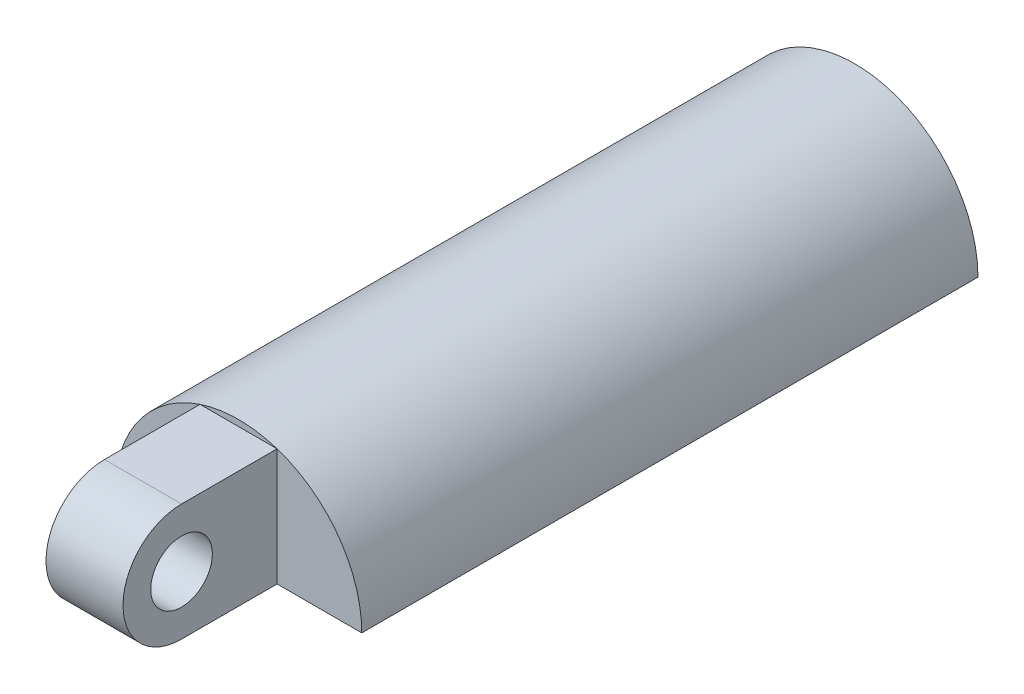
ISO-10303-21;
HEADER;
FILE_DESCRIPTION(('STEP AP214'),'2;1');
FILE_NAME('part.step','',(''),(''),'','','');
FILE_SCHEMA(('AUTOMOTIVE_DESIGN { 1 0 10303 214 1 1 1 1 }'));
ENDSEC;
DATA;
#1=APPLICATION_CONTEXT('core data for automotive mechanical design processes');
#2=APPLICATION_PROTOCOL_DEFINITION('international standard','automotive_design',2000,#1);
#3=PRODUCT_CONTEXT('',#1,'mechanical');
#4=PRODUCT('Part','Part','',(#3));
#5=PRODUCT_RELATED_PRODUCT_CATEGORY('part','',(#4));
#6=PRODUCT_DEFINITION_FORMATION('','',#4);
#7=PRODUCT_DEFINITION_CONTEXT('part definition',#1,'design');
#8=PRODUCT_DEFINITION('design','',#6,#7);
#9=PRODUCT_DEFINITION_SHAPE('','',#8);
#10=(LENGTH_UNIT() NAMED_UNIT(*) SI_UNIT(.MILLI.,.METRE.));
#11=(NAMED_UNIT(*) PLANE_ANGLE_UNIT() SI_UNIT($,.RADIAN.));
#12=(NAMED_UNIT(*) SI_UNIT($,.STERADIAN.) SOLID_ANGLE_UNIT());
#13=UNCERTAINTY_MEASURE_WITH_UNIT(LENGTH_MEASURE(1.E-05),#10,'distance_accuracy_value','');
#14=(GEOMETRIC_REPRESENTATION_CONTEXT(3) GLOBAL_UNCERTAINTY_ASSIGNED_CONTEXT((#13)) GLOBAL_UNIT_ASSIGNED_CONTEXT((#10,
#11,#12)) REPRESENTATION_CONTEXT('',''));
#15=CARTESIAN_POINT('',(0.,0.,0.));
#16=DIRECTION('',(0.,0.,1.));
#17=DIRECTION('',(1.,0.,0.));
#18=AXIS2_PLACEMENT_3D('',#15,#16,#17);
#19=CARTESIAN_POINT('',(-2.5,0.,50.));
#20=DIRECTION('',(-1.,0.,0.));
#21=DIRECTION('',(0.,0.,1.));
#22=AXIS2_PLACEMENT_3D('',#19,#20,#21);
#23=PLANE('',#22);
#24=CARTESIAN_POINT('',(-2.5,3.79967103839266,46.2003289616073));
#25=DIRECTION('',(-1.,0.,0.));
#26=DIRECTION('',(0.,0.,1.));
#27=AXIS2_PLACEMENT_3D('',#24,#25,#26);
#28=CIRCLE('',#27,2.);
#29=CARTESIAN_POINT('',(-2.5,3.79967103839266,48.2003289616073));
#30=VERTEX_POINT('',#29);
#31=EDGE_CURVE('E173',#30,#30,#28,.F.);
#32=ORIENTED_EDGE('',*,*,#31,.T.);
#33=EDGE_LOOP('',(#32));
#34=FACE_BOUND('',#33,.T.);
#35=DIRECTION('',(0.,0.,-1.));
#36=VECTOR('',#35,1.);
#37=CARTESIAN_POINT('',(-2.5,0.,50.));
#38=LINE('',#37,#36);
#39=CARTESIAN_POINT('',(-2.5,0.,46.2003289616073));
#40=VERTEX_POINT('',#39);
#41=CARTESIAN_POINT('',(-2.5,0.,40.));
#42=VERTEX_POINT('',#41);
#43=EDGE_CURVE('E78',#40,#42,#38,.T.);
#44=ORIENTED_EDGE('',*,*,#43,.F.);
#45=CARTESIAN_POINT('',(-2.5,3.79967103839266,46.2003289616073));
#46=DIRECTION('',(-1.,0.,0.));
#47=DIRECTION('',(0.,0.,1.));
#48=AXIS2_PLACEMENT_3D('',#45,#46,#47);
#49=CIRCLE('',#48,3.79967103839266);
#50=CARTESIAN_POINT('',(-2.5,7.59934207678533,46.2003289616073));
#51=VERTEX_POINT('',#50);
#52=EDGE_CURVE('E111',#51,#40,#49,.F.);
#53=ORIENTED_EDGE('',*,*,#52,.F.);
#54=DIRECTION('',(0.,0.,-1.));
#55=VECTOR('',#54,1.);
#56=CARTESIAN_POINT('',(-2.5,7.59934207678533,50.));
#57=LINE('',#56,#55);
#58=CARTESIAN_POINT('',(-2.5,7.59934207678533,40.));
#59=VERTEX_POINT('',#58);
#60=EDGE_CURVE('E139',#51,#59,#57,.T.);
#61=ORIENTED_EDGE('',*,*,#60,.T.);
#62=DIRECTION('',(0.,1.,0.));
#63=VECTOR('',#62,1.);
#64=CARTESIAN_POINT('',(-2.5,0.,40.));
#65=LINE('',#64,#63);
#66=EDGE_CURVE('E126',#42,#59,#65,.T.);
#67=ORIENTED_EDGE('',*,*,#66,.F.);
#68=EDGE_LOOP('',(#44,#53,#61,#67));
#69=FACE_BOUND('',#68,.T.);
#70=ADVANCED_FACE('F55',(#34,#69),#23,.T.);
#71=CARTESIAN_POINT('',(2.5,0.,50.));
#72=DIRECTION('',(-1.,0.,0.));
#73=DIRECTION('',(0.,0.,1.));
#74=AXIS2_PLACEMENT_3D('',#71,#72,#73);
#75=PLANE('',#74);
#76=CARTESIAN_POINT('',(2.5,3.79967103839266,46.2003289616073));
#77=DIRECTION('',(1.,0.,0.));
#78=DIRECTION('',(0.,0.,-1.));
#79=AXIS2_PLACEMENT_3D('',#76,#77,#78);
#80=CIRCLE('',#79,2.);
#81=CARTESIAN_POINT('',(2.5,3.79967103839266,44.2003289616073));
#82=VERTEX_POINT('',#81);
#83=EDGE_CURVE('E122',#82,#82,#80,.T.);
#84=ORIENTED_EDGE('',*,*,#83,.F.);
#85=EDGE_LOOP('',(#84));
#86=FACE_BOUND('',#85,.T.);
#87=CARTESIAN_POINT('',(2.5,3.79967103839266,46.2003289616073));
#88=DIRECTION('',(1.,0.,0.));
#89=DIRECTION('',(0.,0.,-1.));
#90=AXIS2_PLACEMENT_3D('',#87,#88,#89);
#91=CIRCLE('',#90,3.79967103839266);
#92=CARTESIAN_POINT('',(2.5,7.59934207678533,46.2003289616073));
#93=VERTEX_POINT('',#92);
#94=CARTESIAN_POINT('',(2.5,0.,46.2003289616073));
#95=VERTEX_POINT('',#94);
#96=EDGE_CURVE('E118',#93,#95,#91,.T.);
#97=ORIENTED_EDGE('',*,*,#96,.T.);
#98=DIRECTION('',(0.,0.,-1.));
#99=VECTOR('',#98,1.);
#100=CARTESIAN_POINT('',(2.5,0.,50.));
#101=LINE('',#100,#99);
#102=CARTESIAN_POINT('',(2.5,0.,40.));
#103=VERTEX_POINT('',#102);
#104=EDGE_CURVE('E70',#95,#103,#101,.T.);
#105=ORIENTED_EDGE('',*,*,#104,.T.);
#106=DIRECTION('',(0.,1.,0.));
#107=VECTOR('',#106,1.);
#108=CARTESIAN_POINT('',(2.5,0.,40.));
#109=LINE('',#108,#107);
#110=CARTESIAN_POINT('',(2.5,7.59934207678533,40.));
#111=VERTEX_POINT('',#110);
#112=EDGE_CURVE('E135',#103,#111,#109,.T.);
#113=ORIENTED_EDGE('',*,*,#112,.T.);
#114=DIRECTION('',(0.,0.,-1.));
#115=VECTOR('',#114,1.);
#116=CARTESIAN_POINT('',(2.5,7.59934207678533,50.));
#117=LINE('',#116,#115);
#118=EDGE_CURVE('E132',#93,#111,#117,.T.);
#119=ORIENTED_EDGE('',*,*,#118,.F.);
#120=EDGE_LOOP('',(#97,#105,#113,#119));
#121=FACE_BOUND('',#120,.T.);
#122=ADVANCED_FACE('F181',(#86,#121),#75,.F.);
#123=CARTESIAN_POINT('',(0.,0.,40.));
#124=DIRECTION('',(0.,1.,0.));
#125=DIRECTION('',(0.,0.,1.));
#126=AXIS2_PLACEMENT_3D('',#123,#124,#125);
#127=PLANE('',#126);
#128=DIRECTION('',(1.,0.,0.));
#129=VECTOR('',#128,1.);
#130=CARTESIAN_POINT('',(-8.001,0.,46.2003289616073));
#131=LINE('',#130,#129);
#132=EDGE_CURVE('E113',#40,#95,#131,.T.);
#133=ORIENTED_EDGE('',*,*,#132,.F.);
#134=ORIENTED_EDGE('',*,*,#43,.T.);
#135=DIRECTION('',(1.,0.,0.));
#136=VECTOR('',#135,1.);
#137=CARTESIAN_POINT('',(0.,0.,40.));
#138=LINE('',#137,#136);
#139=CARTESIAN_POINT('',(-8.,0.,40.));
#140=VERTEX_POINT('',#139);
#141=EDGE_CURVE('E147',#140,#42,#138,.T.);
#142=ORIENTED_EDGE('',*,*,#141,.F.);
#143=DIRECTION('',(0.,0.,-1.));
#144=VECTOR('',#143,1.);
#145=CARTESIAN_POINT('',(-8.,0.,40.));
#146=LINE('',#145,#144);
#147=CARTESIAN_POINT('',(-8.,0.,0.));
#148=VERTEX_POINT('',#147);
#149=EDGE_CURVE('E12',#140,#148,#146,.T.);
#150=ORIENTED_EDGE('',*,*,#149,.T.);
#151=DIRECTION('',(1.,0.,0.));
#152=VECTOR('',#151,1.);
#153=CARTESIAN_POINT('',(0.,0.,0.));
#154=LINE('',#153,#152);
#155=CARTESIAN_POINT('',(8.,0.,0.));
#156=VERTEX_POINT('',#155);
#157=EDGE_CURVE('E130',#148,#156,#154,.T.);
#158=ORIENTED_EDGE('',*,*,#157,.T.);
#159=DIRECTION('',(0.,0.,-1.));
#160=VECTOR('',#159,1.);
#161=CARTESIAN_POINT('',(8.,0.,40.));
#162=LINE('',#161,#160);
#163=CARTESIAN_POINT('',(8.,0.,40.));
#164=VERTEX_POINT('',#163);
#165=EDGE_CURVE('E63',#164,#156,#162,.T.);
#166=ORIENTED_EDGE('',*,*,#165,.F.);
#167=EDGE_CURVE('E144',#103,#164,#138,.T.);
#168=ORIENTED_EDGE('',*,*,#167,.F.);
#169=ORIENTED_EDGE('',*,*,#104,.F.);
#170=EDGE_LOOP('',(#133,#134,#142,#150,#158,#166,#168,#169));
#171=FACE_BOUND('',#170,.T.);
#172=ADVANCED_FACE('F120',(#171),#127,.F.);
#173=CARTESIAN_POINT('',(-2.5,7.59934207678533,50.));
#174=DIRECTION('',(0.,1.,0.));
#175=DIRECTION('',(0.,0.,1.));
#176=AXIS2_PLACEMENT_3D('',#173,#174,#175);
#177=PLANE('',#176);
#178=ORIENTED_EDGE('',*,*,#60,.F.);
#179=DIRECTION('',(1.,0.,0.));
#180=VECTOR('',#179,1.);
#181=CARTESIAN_POINT('',(-8.001,7.59934207678533,46.2003289616073));
#182=LINE('',#181,#180);
#183=EDGE_CURVE('E115',#51,#93,#182,.T.);
#184=ORIENTED_EDGE('',*,*,#183,.T.);
#185=ORIENTED_EDGE('',*,*,#118,.T.);
#186=DIRECTION('',(1.,0.,0.));
#187=VECTOR('',#186,1.);
#188=CARTESIAN_POINT('',(-2.5,7.59934207678533,40.));
#189=LINE('',#188,#187);
#190=EDGE_CURVE('E165',#59,#111,#189,.T.);
#191=ORIENTED_EDGE('',*,*,#190,.F.);
#192=EDGE_LOOP('',(#178,#184,#185,#191));
#193=FACE_BOUND('',#192,.T.);
#194=ADVANCED_FACE('F167',(#193),#177,.T.);
#195=CARTESIAN_POINT('',(0.,0.,40.));
#196=DIRECTION('',(0.,0.,1.));
#197=DIRECTION('',(1.,0.,0.));
#198=AXIS2_PLACEMENT_3D('',#195,#196,#197);
#199=PLANE('',#198);
#200=ORIENTED_EDGE('',*,*,#141,.T.);
#201=ORIENTED_EDGE('',*,*,#66,.T.);
#202=CARTESIAN_POINT('',(0.,0.,40.));
#203=DIRECTION('',(0.,0.,1.));
#204=DIRECTION('',(1.,0.,0.));
#205=AXIS2_PLACEMENT_3D('',#202,#203,#204);
#206=CIRCLE('',#205,8.);
#207=EDGE_CURVE('E146',#59,#140,#206,.T.);
#208=ORIENTED_EDGE('',*,*,#207,.T.);
#209=EDGE_LOOP('',(#200,#201,#208));
#210=FACE_BOUND('',#209,.T.);
#211=ADVANCED_FACE('F188',(#210),#199,.T.);
#212=EDGE_CURVE('E145',#111,#59,#206,.T.);
#213=ORIENTED_EDGE('',*,*,#212,.T.);
#214=ORIENTED_EDGE('',*,*,#190,.T.);
#215=EDGE_LOOP('',(#213,#214));
#216=FACE_BOUND('',#215,.T.);
#217=ADVANCED_FACE('F164',(#216),#199,.T.);
#218=CARTESIAN_POINT('',(0.,0.,40.));
#219=DIRECTION('',(0.,0.,-1.));
#220=DIRECTION('',(-1.,0.,0.));
#221=AXIS2_PLACEMENT_3D('',#218,#219,#220);
#222=CYLINDRICAL_SURFACE('',#221,8.);
#223=CARTESIAN_POINT('',(0.,0.,0.));
#224=DIRECTION('',(0.,0.,1.));
#225=DIRECTION('',(1.,0.,0.));
#226=AXIS2_PLACEMENT_3D('',#223,#224,#225);
#227=CIRCLE('',#226,8.);
#228=EDGE_CURVE('E127',#156,#148,#227,.T.);
#229=ORIENTED_EDGE('',*,*,#228,.T.);
#230=ORIENTED_EDGE('',*,*,#149,.F.);
#231=ORIENTED_EDGE('',*,*,#207,.F.);
#232=ORIENTED_EDGE('',*,*,#212,.F.);
#233=EDGE_CURVE('E141',#164,#111,#206,.T.);
#234=ORIENTED_EDGE('',*,*,#233,.F.);
#235=ORIENTED_EDGE('',*,*,#165,.T.);
#236=EDGE_LOOP('',(#229,#230,#231,#232,#234,#235));
#237=FACE_BOUND('',#236,.T.);
#238=ADVANCED_FACE('F57',(#237),#222,.T.);
#239=ORIENTED_EDGE('',*,*,#112,.F.);
#240=ORIENTED_EDGE('',*,*,#167,.T.);
#241=ORIENTED_EDGE('',*,*,#233,.T.);
#242=EDGE_LOOP('',(#239,#240,#241));
#243=FACE_BOUND('',#242,.T.);
#244=ADVANCED_FACE('F185',(#243),#199,.T.);
#245=CARTESIAN_POINT('',(0.,0.,0.));
#246=DIRECTION('',(0.,0.,1.));
#247=DIRECTION('',(1.,0.,0.));
#248=AXIS2_PLACEMENT_3D('',#245,#246,#247);
#249=PLANE('',#248);
#250=ORIENTED_EDGE('',*,*,#228,.F.);
#251=ORIENTED_EDGE('',*,*,#157,.F.);
#252=EDGE_LOOP('',(#250,#251));
#253=FACE_BOUND('',#252,.T.);
#254=ADVANCED_FACE('F157',(#253),#249,.F.);
#255=CARTESIAN_POINT('',(-8.001,3.79967103839266,46.2003289616073));
#256=DIRECTION('',(1.,0.,0.));
#257=DIRECTION('',(0.,0.,-1.));
#258=AXIS2_PLACEMENT_3D('',#255,#256,#257);
#259=CYLINDRICAL_SURFACE('',#258,3.79967103839266);
#260=ORIENTED_EDGE('',*,*,#52,.T.);
#261=ORIENTED_EDGE('',*,*,#132,.T.);
#262=ORIENTED_EDGE('',*,*,#96,.F.);
#263=ORIENTED_EDGE('',*,*,#183,.F.);
#264=EDGE_LOOP('',(#260,#261,#262,#263));
#265=FACE_BOUND('',#264,.T.);
#266=ADVANCED_FACE('F112',(#265),#259,.T.);
#267=CARTESIAN_POINT('',(-8.001,3.79967103839266,46.2003289616073));
#268=DIRECTION('',(1.,0.,0.));
#269=DIRECTION('',(0.,0.,-1.));
#270=AXIS2_PLACEMENT_3D('',#267,#268,#269);
#271=CYLINDRICAL_SURFACE('',#270,2.);
#272=ORIENTED_EDGE('',*,*,#31,.F.);
#273=EDGE_LOOP('',(#272));
#274=FACE_BOUND('',#273,.T.);
#275=ORIENTED_EDGE('',*,*,#83,.T.);
#276=EDGE_LOOP('',(#275));
#277=FACE_BOUND('',#276,.T.);
#278=ADVANCED_FACE('F179',(#274,#277),#271,.F.);
#279=CLOSED_SHELL('',(#70,#122,#172,#194,#211,#217,#238,#244,#254,#266,#278));
#280=MANIFOLD_SOLID_BREP('B2',#279);
#281=ADVANCED_BREP_SHAPE_REPRESENTATION('',(#18,#280),#14);
#282=SHAPE_DEFINITION_REPRESENTATION(#9,#281);
ENDSEC;
END-ISO-10303-21;
